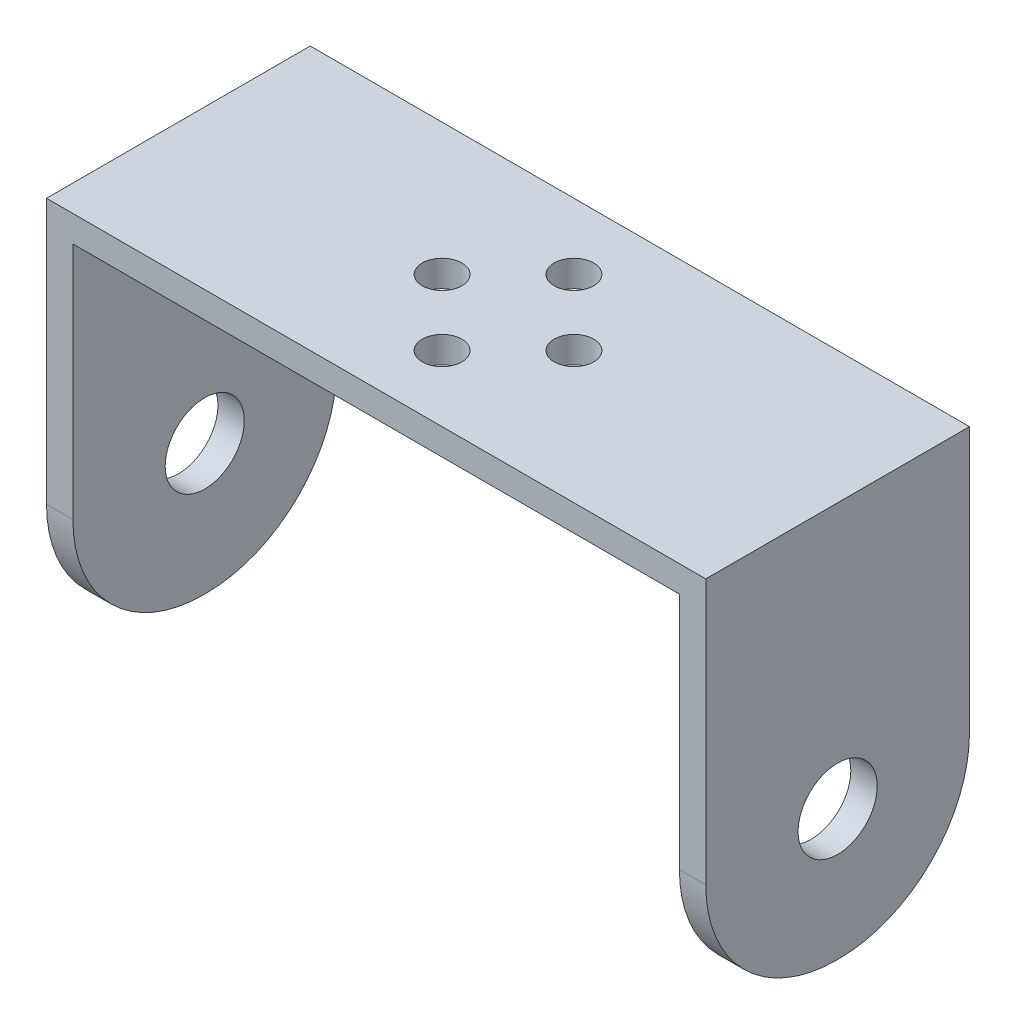
ISO-10303-21;
HEADER;
FILE_DESCRIPTION(('STEP AP214'),'2;1');
FILE_NAME('part.step','',(''),(''),'','','');
FILE_SCHEMA(('AUTOMOTIVE_DESIGN { 1 0 10303 214 1 1 1 1 }'));
ENDSEC;
DATA;
#1=APPLICATION_CONTEXT('core data for automotive mechanical design processes');
#2=APPLICATION_PROTOCOL_DEFINITION('international standard','automotive_design',2000,#1);
#3=PRODUCT_CONTEXT('',#1,'mechanical');
#4=PRODUCT('Part','Part','',(#3));
#5=PRODUCT_RELATED_PRODUCT_CATEGORY('part','',(#4));
#6=PRODUCT_DEFINITION_FORMATION('','',#4);
#7=PRODUCT_DEFINITION_CONTEXT('part definition',#1,'design');
#8=PRODUCT_DEFINITION('design','',#6,#7);
#9=PRODUCT_DEFINITION_SHAPE('','',#8);
#10=(LENGTH_UNIT() NAMED_UNIT(*) SI_UNIT(.MILLI.,.METRE.));
#11=(NAMED_UNIT(*) PLANE_ANGLE_UNIT() SI_UNIT($,.RADIAN.));
#12=(NAMED_UNIT(*) SI_UNIT($,.STERADIAN.) SOLID_ANGLE_UNIT());
#13=UNCERTAINTY_MEASURE_WITH_UNIT(LENGTH_MEASURE(1.E-05),#10,'distance_accuracy_value','');
#14=(GEOMETRIC_REPRESENTATION_CONTEXT(3) GLOBAL_UNCERTAINTY_ASSIGNED_CONTEXT((#13)) GLOBAL_UNIT_ASSIGNED_CONTEXT((#10,
#11,#12)) REPRESENTATION_CONTEXT('',''));
#15=CARTESIAN_POINT('',(0.,0.,0.));
#16=DIRECTION('',(0.,0.,1.));
#17=DIRECTION('',(1.,0.,0.));
#18=AXIS2_PLACEMENT_3D('',#15,#16,#17);
#19=CARTESIAN_POINT('',(0.,0.,0.));
#20=DIRECTION('',(0.,1.,0.));
#21=DIRECTION('',(0.,0.,1.));
#22=AXIS2_PLACEMENT_3D('',#19,#20,#21);
#23=PLANE('',#22);
#24=CARTESIAN_POINT('',(0.,0.,-5.));
#25=DIRECTION('',(0.,1.,0.));
#26=DIRECTION('',(0.,0.,1.));
#27=AXIS2_PLACEMENT_3D('',#24,#25,#26);
#28=CIRCLE('',#27,1.5);
#29=CARTESIAN_POINT('',(0.,0.,-3.5));
#30=VERTEX_POINT('',#29);
#31=EDGE_CURVE('E458',#30,#30,#28,.T.);
#32=ORIENTED_EDGE('',*,*,#31,.T.);
#33=EDGE_LOOP('',(#32));
#34=FACE_BOUND('',#33,.T.);
#35=CARTESIAN_POINT('',(5.,0.,0.));
#36=DIRECTION('',(0.,1.,0.));
#37=DIRECTION('',(0.,0.,1.));
#38=AXIS2_PLACEMENT_3D('',#35,#36,#37);
#39=CIRCLE('',#38,1.5);
#40=CARTESIAN_POINT('',(5.,0.,1.5));
#41=VERTEX_POINT('',#40);
#42=EDGE_CURVE('E463',#41,#41,#39,.T.);
#43=ORIENTED_EDGE('',*,*,#42,.T.);
#44=EDGE_LOOP('',(#43));
#45=FACE_BOUND('',#44,.T.);
#46=CARTESIAN_POINT('',(0.,0.,5.));
#47=DIRECTION('',(0.,1.,0.));
#48=DIRECTION('',(0.,0.,1.));
#49=AXIS2_PLACEMENT_3D('',#46,#47,#48);
#50=CIRCLE('',#49,1.5);
#51=CARTESIAN_POINT('',(0.,0.,6.5));
#52=VERTEX_POINT('',#51);
#53=EDGE_CURVE('E476',#52,#52,#50,.T.);
#54=ORIENTED_EDGE('',*,*,#53,.T.);
#55=EDGE_LOOP('',(#54));
#56=FACE_BOUND('',#55,.T.);
#57=CARTESIAN_POINT('',(-5.,0.,0.));
#58=DIRECTION('',(0.,1.,0.));
#59=DIRECTION('',(0.,0.,1.));
#60=AXIS2_PLACEMENT_3D('',#57,#58,#59);
#61=CIRCLE('',#60,1.5);
#62=CARTESIAN_POINT('',(-5.,0.,1.5));
#63=VERTEX_POINT('',#62);
#64=EDGE_CURVE('E484',#63,#63,#61,.T.);
#65=ORIENTED_EDGE('',*,*,#64,.T.);
#66=EDGE_LOOP('',(#65));
#67=FACE_BOUND('',#66,.T.);
#68=DIRECTION('',(0.,0.,-1.));
#69=VECTOR('',#68,1.);
#70=CARTESIAN_POINT('',(23.,0.,0.));
#71=LINE('',#70,#69);
#72=CARTESIAN_POINT('',(23.,0.,9.99999999999999));
#73=VERTEX_POINT('',#72);
#74=CARTESIAN_POINT('',(23.,0.,-10.));
#75=VERTEX_POINT('',#74);
#76=EDGE_CURVE('E184',#73,#75,#71,.T.);
#77=ORIENTED_EDGE('',*,*,#76,.F.);
#78=DIRECTION('',(1.,0.,0.));
#79=VECTOR('',#78,1.);
#80=CARTESIAN_POINT('',(25.,0.,9.99999999999999));
#81=LINE('',#80,#79);
#82=CARTESIAN_POINT('',(-23.,0.,10.));
#83=VERTEX_POINT('',#82);
#84=EDGE_CURVE('E135',#83,#73,#81,.T.);
#85=ORIENTED_EDGE('',*,*,#84,.F.);
#86=DIRECTION('',(0.,0.,1.));
#87=VECTOR('',#86,1.);
#88=CARTESIAN_POINT('',(-23.,0.,0.));
#89=LINE('',#88,#87);
#90=CARTESIAN_POINT('',(-23.,0.,-10.));
#91=VERTEX_POINT('',#90);
#92=EDGE_CURVE('E11',#91,#83,#89,.T.);
#93=ORIENTED_EDGE('',*,*,#92,.F.);
#94=DIRECTION('',(-1.,0.,0.));
#95=VECTOR('',#94,1.);
#96=CARTESIAN_POINT('',(25.,0.,-10.));
#97=LINE('',#96,#95);
#98=EDGE_CURVE('E248',#75,#91,#97,.T.);
#99=ORIENTED_EDGE('',*,*,#98,.F.);
#100=EDGE_LOOP('',(#77,#85,#93,#99));
#101=FACE_BOUND('',#100,.T.);
#102=ADVANCED_FACE('F38',(#34,#45,#56,#67,#101),#23,.F.);
#103=CARTESIAN_POINT('',(-25.,2.,10.));
#104=DIRECTION('',(1.,0.,0.));
#105=DIRECTION('',(0.,0.,-1.));
#106=AXIS2_PLACEMENT_3D('',#103,#104,#105);
#107=PLANE('',#106);
#108=DIRECTION('',(0.,-1.,0.));
#109=VECTOR('',#108,1.);
#110=CARTESIAN_POINT('',(-25.,2.,-10.));
#111=LINE('',#110,#109);
#112=CARTESIAN_POINT('',(-25.,2.,-10.));
#113=VERTEX_POINT('',#112);
#114=CARTESIAN_POINT('',(-25.,-18.1,-10.));
#115=VERTEX_POINT('',#114);
#116=EDGE_CURVE('E255',#113,#115,#111,.T.);
#117=ORIENTED_EDGE('',*,*,#116,.T.);
#118=CARTESIAN_POINT('',(-25.,-18.1,-0.0999999999999952));
#119=DIRECTION('',(-1.,0.,0.));
#120=DIRECTION('',(0.,0.,1.));
#121=AXIS2_PLACEMENT_3D('',#118,#119,#120);
#122=CIRCLE('',#121,9.9);
#123=CARTESIAN_POINT('',(-25.,-28.,-0.0999999999999952));
#124=VERTEX_POINT('',#123);
#125=EDGE_CURVE('E197',#115,#124,#122,.T.);
#126=ORIENTED_EDGE('',*,*,#125,.T.);
#127=DIRECTION('',(0.,0.,1.));
#128=VECTOR('',#127,1.);
#129=CARTESIAN_POINT('',(-25.,-28.,-0.0999999999999952));
#130=LINE('',#129,#128);
#131=CARTESIAN_POINT('',(-25.,-28.,0.100000000000002));
#132=VERTEX_POINT('',#131);
#133=EDGE_CURVE('E224',#124,#132,#130,.T.);
#134=ORIENTED_EDGE('',*,*,#133,.T.);
#135=CARTESIAN_POINT('',(-25.,-18.1,0.100000000000004));
#136=DIRECTION('',(-1.,0.,0.));
#137=DIRECTION('',(0.,0.,1.));
#138=AXIS2_PLACEMENT_3D('',#135,#136,#137);
#139=CIRCLE('',#138,9.9);
#140=CARTESIAN_POINT('',(-25.,-18.1,10.));
#141=VERTEX_POINT('',#140);
#142=EDGE_CURVE('E205',#132,#141,#139,.T.);
#143=ORIENTED_EDGE('',*,*,#142,.T.);
#144=DIRECTION('',(0.,-1.,0.));
#145=VECTOR('',#144,1.);
#146=CARTESIAN_POINT('',(-25.,2.,10.));
#147=LINE('',#146,#145);
#148=CARTESIAN_POINT('',(-25.,2.,10.));
#149=VERTEX_POINT('',#148);
#150=EDGE_CURVE('E47',#149,#141,#147,.T.);
#151=ORIENTED_EDGE('',*,*,#150,.F.);
#152=DIRECTION('',(0.,0.,1.));
#153=VECTOR('',#152,1.);
#154=CARTESIAN_POINT('',(-25.,2.,10.));
#155=LINE('',#154,#153);
#156=EDGE_CURVE('E244',#113,#149,#155,.T.);
#157=ORIENTED_EDGE('',*,*,#156,.F.);
#158=EDGE_LOOP('',(#117,#126,#134,#143,#151,#157));
#159=FACE_BOUND('',#158,.T.);
#160=CARTESIAN_POINT('',(-25.,-18.1,0.));
#161=DIRECTION('',(-1.,0.,0.));
#162=DIRECTION('',(0.,0.,1.));
#163=AXIS2_PLACEMENT_3D('',#160,#161,#162);
#164=CIRCLE('',#163,3.);
#165=CARTESIAN_POINT('',(-25.,-18.1,3.));
#166=VERTEX_POINT('',#165);
#167=EDGE_CURVE('E192',#166,#166,#164,.T.);
#168=ORIENTED_EDGE('',*,*,#167,.F.);
#169=EDGE_LOOP('',(#168));
#170=FACE_BOUND('',#169,.T.);
#171=ADVANCED_FACE('F40',(#159,#170),#107,.F.);
#172=CARTESIAN_POINT('',(25.,2.,9.99999999999999));
#173=DIRECTION('',(0.,0.,-1.));
#174=DIRECTION('',(-1.,0.,0.));
#175=AXIS2_PLACEMENT_3D('',#172,#173,#174);
#176=PLANE('',#175);
#177=DIRECTION('',(0.,-1.,0.));
#178=VECTOR('',#177,1.);
#179=CARTESIAN_POINT('',(25.,2.,9.99999999999999));
#180=LINE('',#179,#178);
#181=CARTESIAN_POINT('',(25.,2.,9.99999999999999));
#182=VERTEX_POINT('',#181);
#183=CARTESIAN_POINT('',(25.,-18.1,10.));
#184=VERTEX_POINT('',#183);
#185=EDGE_CURVE('E265',#182,#184,#180,.T.);
#186=ORIENTED_EDGE('',*,*,#185,.F.);
#187=DIRECTION('',(1.,0.,0.));
#188=VECTOR('',#187,1.);
#189=CARTESIAN_POINT('',(25.,2.,9.99999999999999));
#190=LINE('',#189,#188);
#191=EDGE_CURVE('E247',#149,#182,#190,.T.);
#192=ORIENTED_EDGE('',*,*,#191,.F.);
#193=ORIENTED_EDGE('',*,*,#150,.T.);
#194=DIRECTION('',(-1.,0.,0.));
#195=VECTOR('',#194,1.);
#196=CARTESIAN_POINT('',(-23.,-18.1,10.));
#197=LINE('',#196,#195);
#198=CARTESIAN_POINT('',(-23.,-18.1,10.));
#199=VERTEX_POINT('',#198);
#200=EDGE_CURVE('E231',#199,#141,#197,.T.);
#201=ORIENTED_EDGE('',*,*,#200,.F.);
#202=DIRECTION('',(0.,1.,0.));
#203=VECTOR('',#202,1.);
#204=CARTESIAN_POINT('',(-23.,2.,10.));
#205=LINE('',#204,#203);
#206=EDGE_CURVE('E217',#199,#83,#205,.T.);
#207=ORIENTED_EDGE('',*,*,#206,.T.);
#208=ORIENTED_EDGE('',*,*,#84,.T.);
#209=DIRECTION('',(0.,-1.,0.));
#210=VECTOR('',#209,1.);
#211=CARTESIAN_POINT('',(23.,2.,9.99999999999999));
#212=LINE('',#211,#210);
#213=CARTESIAN_POINT('',(23.,-18.1,10.));
#214=VERTEX_POINT('',#213);
#215=EDGE_CURVE('E127',#73,#214,#212,.T.);
#216=ORIENTED_EDGE('',*,*,#215,.T.);
#217=DIRECTION('',(1.,0.,0.));
#218=VECTOR('',#217,1.);
#219=CARTESIAN_POINT('',(23.,-18.1,10.));
#220=LINE('',#219,#218);
#221=EDGE_CURVE('E131',#214,#184,#220,.T.);
#222=ORIENTED_EDGE('',*,*,#221,.T.);
#223=EDGE_LOOP('',(#186,#192,#193,#201,#207,#208,#216,#222));
#224=FACE_BOUND('',#223,.T.);
#225=ADVANCED_FACE('F130',(#224),#176,.F.);
#226=CARTESIAN_POINT('',(25.,2.,9.99999999999999));
#227=DIRECTION('',(-1.,0.,0.));
#228=DIRECTION('',(0.,0.,1.));
#229=AXIS2_PLACEMENT_3D('',#226,#227,#228);
#230=PLANE('',#229);
#231=ORIENTED_EDGE('',*,*,#185,.T.);
#232=CARTESIAN_POINT('',(25.,-18.1,0.0999999999999994));
#233=DIRECTION('',(1.,0.,0.));
#234=DIRECTION('',(0.,0.,-1.));
#235=AXIS2_PLACEMENT_3D('',#232,#233,#234);
#236=CIRCLE('',#235,9.9);
#237=CARTESIAN_POINT('',(25.,-28.,0.0999999999999994));
#238=VERTEX_POINT('',#237);
#239=EDGE_CURVE('E147',#184,#238,#236,.T.);
#240=ORIENTED_EDGE('',*,*,#239,.T.);
#241=DIRECTION('',(0.,0.,-1.));
#242=VECTOR('',#241,1.);
#243=CARTESIAN_POINT('',(25.,-28.,0.0999999999999994));
#244=LINE('',#243,#242);
#245=CARTESIAN_POINT('',(25.,-28.,-0.100000000000004));
#246=VERTEX_POINT('',#245);
#247=EDGE_CURVE('E172',#238,#246,#244,.T.);
#248=ORIENTED_EDGE('',*,*,#247,.T.);
#249=CARTESIAN_POINT('',(25.,-18.1,-0.100000000000005));
#250=DIRECTION('',(1.,0.,0.));
#251=DIRECTION('',(0.,0.,-1.));
#252=AXIS2_PLACEMENT_3D('',#249,#250,#251);
#253=CIRCLE('',#252,9.9);
#254=CARTESIAN_POINT('',(25.,-18.1,-10.));
#255=VERTEX_POINT('',#254);
#256=EDGE_CURVE('E141',#246,#255,#253,.T.);
#257=ORIENTED_EDGE('',*,*,#256,.T.);
#258=DIRECTION('',(0.,-1.,0.));
#259=VECTOR('',#258,1.);
#260=CARTESIAN_POINT('',(25.,2.,-10.));
#261=LINE('',#260,#259);
#262=CARTESIAN_POINT('',(25.,2.,-10.));
#263=VERTEX_POINT('',#262);
#264=EDGE_CURVE('E262',#263,#255,#261,.T.);
#265=ORIENTED_EDGE('',*,*,#264,.F.);
#266=DIRECTION('',(0.,0.,-1.));
#267=VECTOR('',#266,1.);
#268=CARTESIAN_POINT('',(25.,2.,9.99999999999999));
#269=LINE('',#268,#267);
#270=EDGE_CURVE('E59',#182,#263,#269,.T.);
#271=ORIENTED_EDGE('',*,*,#270,.F.);
#272=EDGE_LOOP('',(#231,#240,#248,#257,#265,#271));
#273=FACE_BOUND('',#272,.T.);
#274=CARTESIAN_POINT('',(25.,-18.1,0.));
#275=DIRECTION('',(1.,0.,0.));
#276=DIRECTION('',(0.,0.,-1.));
#277=AXIS2_PLACEMENT_3D('',#274,#275,#276);
#278=CIRCLE('',#277,3.);
#279=CARTESIAN_POINT('',(25.,-18.1,-3.));
#280=VERTEX_POINT('',#279);
#281=EDGE_CURVE('E467',#280,#280,#278,.T.);
#282=ORIENTED_EDGE('',*,*,#281,.F.);
#283=EDGE_LOOP('',(#282));
#284=FACE_BOUND('',#283,.T.);
#285=ADVANCED_FACE('F296',(#273,#284),#230,.F.);
#286=CARTESIAN_POINT('',(25.,2.,-10.));
#287=DIRECTION('',(0.,0.,1.));
#288=DIRECTION('',(1.,0.,0.));
#289=AXIS2_PLACEMENT_3D('',#286,#287,#288);
#290=PLANE('',#289);
#291=ORIENTED_EDGE('',*,*,#264,.T.);
#292=DIRECTION('',(1.,0.,0.));
#293=VECTOR('',#292,1.);
#294=CARTESIAN_POINT('',(23.,-18.1,-10.));
#295=LINE('',#294,#293);
#296=CARTESIAN_POINT('',(23.,-18.1,-10.));
#297=VERTEX_POINT('',#296);
#298=EDGE_CURVE('E180',#297,#255,#295,.T.);
#299=ORIENTED_EDGE('',*,*,#298,.F.);
#300=DIRECTION('',(0.,1.,0.));
#301=VECTOR('',#300,1.);
#302=CARTESIAN_POINT('',(23.,2.,-10.));
#303=LINE('',#302,#301);
#304=EDGE_CURVE('E150',#297,#75,#303,.T.);
#305=ORIENTED_EDGE('',*,*,#304,.T.);
#306=ORIENTED_EDGE('',*,*,#98,.T.);
#307=DIRECTION('',(0.,-1.,0.));
#308=VECTOR('',#307,1.);
#309=CARTESIAN_POINT('',(-23.,2.,-10.));
#310=LINE('',#309,#308);
#311=CARTESIAN_POINT('',(-23.,-18.1,-10.));
#312=VERTEX_POINT('',#311);
#313=EDGE_CURVE('E201',#91,#312,#310,.T.);
#314=ORIENTED_EDGE('',*,*,#313,.T.);
#315=DIRECTION('',(-1.,0.,0.));
#316=VECTOR('',#315,1.);
#317=CARTESIAN_POINT('',(-23.,-18.1,-10.));
#318=LINE('',#317,#316);
#319=EDGE_CURVE('E220',#312,#115,#318,.T.);
#320=ORIENTED_EDGE('',*,*,#319,.T.);
#321=ORIENTED_EDGE('',*,*,#116,.F.);
#322=DIRECTION('',(-1.,0.,0.));
#323=VECTOR('',#322,1.);
#324=CARTESIAN_POINT('',(25.,2.,-10.));
#325=LINE('',#324,#323);
#326=EDGE_CURVE('E54',#263,#113,#325,.T.);
#327=ORIENTED_EDGE('',*,*,#326,.F.);
#328=EDGE_LOOP('',(#291,#299,#305,#306,#314,#320,#321,#327));
#329=FACE_BOUND('',#328,.T.);
#330=ADVANCED_FACE('F291',(#329),#290,.F.);
#331=CARTESIAN_POINT('',(0.,2.,0.));
#332=DIRECTION('',(0.,1.,0.));
#333=DIRECTION('',(0.,0.,1.));
#334=AXIS2_PLACEMENT_3D('',#331,#332,#333);
#335=PLANE('',#334);
#336=CARTESIAN_POINT('',(0.,2.,-5.));
#337=DIRECTION('',(0.,1.,0.));
#338=DIRECTION('',(0.,0.,1.));
#339=AXIS2_PLACEMENT_3D('',#336,#337,#338);
#340=CIRCLE('',#339,1.5);
#341=CARTESIAN_POINT('',(0.,2.,-3.5));
#342=VERTEX_POINT('',#341);
#343=EDGE_CURVE('E461',#342,#342,#340,.T.);
#344=ORIENTED_EDGE('',*,*,#343,.F.);
#345=EDGE_LOOP('',(#344));
#346=FACE_BOUND('',#345,.T.);
#347=CARTESIAN_POINT('',(5.,2.,0.));
#348=DIRECTION('',(0.,1.,0.));
#349=DIRECTION('',(0.,0.,1.));
#350=AXIS2_PLACEMENT_3D('',#347,#348,#349);
#351=CIRCLE('',#350,1.5);
#352=CARTESIAN_POINT('',(5.,2.,1.5));
#353=VERTEX_POINT('',#352);
#354=EDGE_CURVE('E470',#353,#353,#351,.T.);
#355=ORIENTED_EDGE('',*,*,#354,.F.);
#356=EDGE_LOOP('',(#355));
#357=FACE_BOUND('',#356,.T.);
#358=CARTESIAN_POINT('',(0.,2.,5.));
#359=DIRECTION('',(0.,1.,0.));
#360=DIRECTION('',(0.,0.,1.));
#361=AXIS2_PLACEMENT_3D('',#358,#359,#360);
#362=CIRCLE('',#361,1.5);
#363=CARTESIAN_POINT('',(0.,2.,6.5));
#364=VERTEX_POINT('',#363);
#365=EDGE_CURVE('E480',#364,#364,#362,.T.);
#366=ORIENTED_EDGE('',*,*,#365,.F.);
#367=EDGE_LOOP('',(#366));
#368=FACE_BOUND('',#367,.T.);
#369=CARTESIAN_POINT('',(-5.,2.,0.));
#370=DIRECTION('',(0.,1.,0.));
#371=DIRECTION('',(0.,0.,1.));
#372=AXIS2_PLACEMENT_3D('',#369,#370,#371);
#373=CIRCLE('',#372,1.5);
#374=CARTESIAN_POINT('',(-5.,2.,1.5));
#375=VERTEX_POINT('',#374);
#376=EDGE_CURVE('E488',#375,#375,#373,.T.);
#377=ORIENTED_EDGE('',*,*,#376,.F.);
#378=EDGE_LOOP('',(#377));
#379=FACE_BOUND('',#378,.T.);
#380=ORIENTED_EDGE('',*,*,#326,.T.);
#381=ORIENTED_EDGE('',*,*,#156,.T.);
#382=ORIENTED_EDGE('',*,*,#191,.T.);
#383=ORIENTED_EDGE('',*,*,#270,.T.);
#384=EDGE_LOOP('',(#380,#381,#382,#383));
#385=FACE_BOUND('',#384,.T.);
#386=ADVANCED_FACE('F322',(#346,#357,#368,#379,#385),#335,.T.);
#387=CARTESIAN_POINT('',(-23.,-18.1,-0.0999999999999952));
#388=DIRECTION('',(-1.,0.,0.));
#389=DIRECTION('',(0.,0.,1.));
#390=AXIS2_PLACEMENT_3D('',#387,#388,#389);
#391=PLANE('',#390);
#392=CARTESIAN_POINT('',(-23.,-18.1,0.));
#393=DIRECTION('',(-1.,0.,0.));
#394=DIRECTION('',(0.,0.,1.));
#395=AXIS2_PLACEMENT_3D('',#392,#393,#394);
#396=CIRCLE('',#395,3.);
#397=CARTESIAN_POINT('',(-23.,-18.1,3.));
#398=VERTEX_POINT('',#397);
#399=EDGE_CURVE('E193',#398,#398,#396,.T.);
#400=ORIENTED_EDGE('',*,*,#399,.T.);
#401=EDGE_LOOP('',(#400));
#402=FACE_BOUND('',#401,.T.);
#403=ORIENTED_EDGE('',*,*,#313,.F.);
#404=ORIENTED_EDGE('',*,*,#92,.T.);
#405=ORIENTED_EDGE('',*,*,#206,.F.);
#406=CARTESIAN_POINT('',(-23.,-18.1,0.100000000000004));
#407=DIRECTION('',(-1.,0.,0.));
#408=DIRECTION('',(0.,0.,1.));
#409=AXIS2_PLACEMENT_3D('',#406,#407,#408);
#410=CIRCLE('',#409,9.9);
#411=CARTESIAN_POINT('',(-23.,-28.,0.100000000000002));
#412=VERTEX_POINT('',#411);
#413=EDGE_CURVE('E213',#412,#199,#410,.T.);
#414=ORIENTED_EDGE('',*,*,#413,.F.);
#415=DIRECTION('',(0.,0.,1.));
#416=VECTOR('',#415,1.);
#417=CARTESIAN_POINT('',(-23.,-28.,-0.0999999999999952));
#418=LINE('',#417,#416);
#419=CARTESIAN_POINT('',(-23.,-28.,-0.0999999999999952));
#420=VERTEX_POINT('',#419);
#421=EDGE_CURVE('E209',#420,#412,#418,.T.);
#422=ORIENTED_EDGE('',*,*,#421,.F.);
#423=CARTESIAN_POINT('',(-23.,-18.1,-0.0999999999999952));
#424=DIRECTION('',(-1.,0.,0.));
#425=DIRECTION('',(0.,0.,1.));
#426=AXIS2_PLACEMENT_3D('',#423,#424,#425);
#427=CIRCLE('',#426,9.9);
#428=EDGE_CURVE('E204',#312,#420,#427,.T.);
#429=ORIENTED_EDGE('',*,*,#428,.F.);
#430=EDGE_LOOP('',(#403,#404,#405,#414,#422,#429));
#431=FACE_BOUND('',#430,.T.);
#432=ADVANCED_FACE('F284',(#402,#431),#391,.F.);
#433=CARTESIAN_POINT('',(-23.,-18.1,0.100000000000004));
#434=DIRECTION('',(-1.,0.,0.));
#435=DIRECTION('',(0.,0.,1.));
#436=AXIS2_PLACEMENT_3D('',#433,#434,#435);
#437=CYLINDRICAL_SURFACE('',#436,9.9);
#438=ORIENTED_EDGE('',*,*,#142,.F.);
#439=DIRECTION('',(-1.,0.,0.));
#440=VECTOR('',#439,1.);
#441=CARTESIAN_POINT('',(-23.,-28.,0.100000000000002));
#442=LINE('',#441,#440);
#443=EDGE_CURVE('E235',#412,#132,#442,.T.);
#444=ORIENTED_EDGE('',*,*,#443,.F.);
#445=ORIENTED_EDGE('',*,*,#413,.T.);
#446=ORIENTED_EDGE('',*,*,#200,.T.);
#447=EDGE_LOOP('',(#438,#444,#445,#446));
#448=FACE_BOUND('',#447,.T.);
#449=ADVANCED_FACE('F274',(#448),#437,.T.);
#450=CARTESIAN_POINT('',(-23.,-28.,-0.0999999999999952));
#451=DIRECTION('',(0.,-1.,0.));
#452=DIRECTION('',(0.,0.,-1.));
#453=AXIS2_PLACEMENT_3D('',#450,#451,#452);
#454=PLANE('',#453);
#455=ORIENTED_EDGE('',*,*,#133,.F.);
#456=DIRECTION('',(-1.,0.,0.));
#457=VECTOR('',#456,1.);
#458=CARTESIAN_POINT('',(-23.,-28.,-0.0999999999999952));
#459=LINE('',#458,#457);
#460=EDGE_CURVE('E238',#420,#124,#459,.T.);
#461=ORIENTED_EDGE('',*,*,#460,.F.);
#462=ORIENTED_EDGE('',*,*,#421,.T.);
#463=ORIENTED_EDGE('',*,*,#443,.T.);
#464=EDGE_LOOP('',(#455,#461,#462,#463));
#465=FACE_BOUND('',#464,.T.);
#466=ADVANCED_FACE('F280',(#465),#454,.T.);
#467=CARTESIAN_POINT('',(-23.,-18.1,-0.0999999999999952));
#468=DIRECTION('',(-1.,0.,0.));
#469=DIRECTION('',(0.,0.,1.));
#470=AXIS2_PLACEMENT_3D('',#467,#468,#469);
#471=CYLINDRICAL_SURFACE('',#470,9.9);
#472=ORIENTED_EDGE('',*,*,#125,.F.);
#473=ORIENTED_EDGE('',*,*,#319,.F.);
#474=ORIENTED_EDGE('',*,*,#428,.T.);
#475=ORIENTED_EDGE('',*,*,#460,.T.);
#476=EDGE_LOOP('',(#472,#473,#474,#475));
#477=FACE_BOUND('',#476,.T.);
#478=ADVANCED_FACE('F371',(#477),#471,.T.);
#479=CARTESIAN_POINT('',(-23.,-18.1,0.));
#480=DIRECTION('',(-1.,0.,0.));
#481=DIRECTION('',(0.,0.,1.));
#482=AXIS2_PLACEMENT_3D('',#479,#480,#481);
#483=CYLINDRICAL_SURFACE('',#482,3.);
#484=ORIENTED_EDGE('',*,*,#399,.F.);
#485=EDGE_LOOP('',(#484));
#486=FACE_BOUND('',#485,.T.);
#487=ORIENTED_EDGE('',*,*,#167,.T.);
#488=EDGE_LOOP('',(#487));
#489=FACE_BOUND('',#488,.T.);
#490=ADVANCED_FACE('F378',(#486,#489),#483,.F.);
#491=CARTESIAN_POINT('',(23.,-18.1,0.0999999999999994));
#492=DIRECTION('',(1.,0.,0.));
#493=DIRECTION('',(0.,0.,-1.));
#494=AXIS2_PLACEMENT_3D('',#491,#492,#493);
#495=PLANE('',#494);
#496=CARTESIAN_POINT('',(23.,-18.1,0.));
#497=DIRECTION('',(1.,0.,0.));
#498=DIRECTION('',(0.,0.,-1.));
#499=AXIS2_PLACEMENT_3D('',#496,#497,#498);
#500=CIRCLE('',#499,3.);
#501=CARTESIAN_POINT('',(23.,-18.1,-3.));
#502=VERTEX_POINT('',#501);
#503=EDGE_CURVE('E173',#502,#502,#500,.T.);
#504=ORIENTED_EDGE('',*,*,#503,.T.);
#505=EDGE_LOOP('',(#504));
#506=FACE_BOUND('',#505,.T.);
#507=ORIENTED_EDGE('',*,*,#215,.F.);
#508=ORIENTED_EDGE('',*,*,#76,.T.);
#509=ORIENTED_EDGE('',*,*,#304,.F.);
#510=CARTESIAN_POINT('',(23.,-18.1,-0.100000000000005));
#511=DIRECTION('',(1.,0.,0.));
#512=DIRECTION('',(0.,0.,-1.));
#513=AXIS2_PLACEMENT_3D('',#510,#511,#512);
#514=CIRCLE('',#513,9.9);
#515=CARTESIAN_POINT('',(23.,-28.,-0.100000000000004));
#516=VERTEX_POINT('',#515);
#517=EDGE_CURVE('E160',#516,#297,#514,.T.);
#518=ORIENTED_EDGE('',*,*,#517,.F.);
#519=DIRECTION('',(0.,0.,-1.));
#520=VECTOR('',#519,1.);
#521=CARTESIAN_POINT('',(23.,-28.,0.0999999999999994));
#522=LINE('',#521,#520);
#523=CARTESIAN_POINT('',(23.,-28.,0.0999999999999994));
#524=VERTEX_POINT('',#523);
#525=EDGE_CURVE('E156',#524,#516,#522,.T.);
#526=ORIENTED_EDGE('',*,*,#525,.F.);
#527=CARTESIAN_POINT('',(23.,-18.1,0.0999999999999994));
#528=DIRECTION('',(1.,0.,0.));
#529=DIRECTION('',(0.,0.,-1.));
#530=AXIS2_PLACEMENT_3D('',#527,#528,#529);
#531=CIRCLE('',#530,9.9);
#532=EDGE_CURVE('E140',#214,#524,#531,.T.);
#533=ORIENTED_EDGE('',*,*,#532,.F.);
#534=EDGE_LOOP('',(#507,#508,#509,#518,#526,#533));
#535=FACE_BOUND('',#534,.T.);
#536=ADVANCED_FACE('F153',(#506,#535),#495,.F.);
#537=CARTESIAN_POINT('',(23.,-18.1,-0.100000000000005));
#538=DIRECTION('',(1.,0.,0.));
#539=DIRECTION('',(0.,0.,-1.));
#540=AXIS2_PLACEMENT_3D('',#537,#538,#539);
#541=CYLINDRICAL_SURFACE('',#540,9.9);
#542=ORIENTED_EDGE('',*,*,#256,.F.);
#543=DIRECTION('',(1.,0.,0.));
#544=VECTOR('',#543,1.);
#545=CARTESIAN_POINT('',(23.,-28.,-0.100000000000004));
#546=LINE('',#545,#544);
#547=EDGE_CURVE('E185',#516,#246,#546,.T.);
#548=ORIENTED_EDGE('',*,*,#547,.F.);
#549=ORIENTED_EDGE('',*,*,#517,.T.);
#550=ORIENTED_EDGE('',*,*,#298,.T.);
#551=EDGE_LOOP('',(#542,#548,#549,#550));
#552=FACE_BOUND('',#551,.T.);
#553=ADVANCED_FACE('F294',(#552),#541,.T.);
#554=CARTESIAN_POINT('',(23.,-28.,0.0999999999999994));
#555=DIRECTION('',(0.,-1.,0.));
#556=DIRECTION('',(0.,0.,-1.));
#557=AXIS2_PLACEMENT_3D('',#554,#555,#556);
#558=PLANE('',#557);
#559=ORIENTED_EDGE('',*,*,#247,.F.);
#560=DIRECTION('',(1.,0.,0.));
#561=VECTOR('',#560,1.);
#562=CARTESIAN_POINT('',(23.,-28.,0.0999999999999994));
#563=LINE('',#562,#561);
#564=EDGE_CURVE('E149',#524,#238,#563,.T.);
#565=ORIENTED_EDGE('',*,*,#564,.F.);
#566=ORIENTED_EDGE('',*,*,#525,.T.);
#567=ORIENTED_EDGE('',*,*,#547,.T.);
#568=EDGE_LOOP('',(#559,#565,#566,#567));
#569=FACE_BOUND('',#568,.T.);
#570=ADVANCED_FACE('F300',(#569),#558,.T.);
#571=CARTESIAN_POINT('',(23.,-18.1,0.0999999999999994));
#572=DIRECTION('',(1.,0.,0.));
#573=DIRECTION('',(0.,0.,-1.));
#574=AXIS2_PLACEMENT_3D('',#571,#572,#573);
#575=CYLINDRICAL_SURFACE('',#574,9.9);
#576=ORIENTED_EDGE('',*,*,#239,.F.);
#577=ORIENTED_EDGE('',*,*,#221,.F.);
#578=ORIENTED_EDGE('',*,*,#532,.T.);
#579=ORIENTED_EDGE('',*,*,#564,.T.);
#580=EDGE_LOOP('',(#576,#577,#578,#579));
#581=FACE_BOUND('',#580,.T.);
#582=ADVANCED_FACE('F145',(#581),#575,.T.);
#583=CARTESIAN_POINT('',(23.,-18.1,0.));
#584=DIRECTION('',(1.,0.,0.));
#585=DIRECTION('',(0.,0.,-1.));
#586=AXIS2_PLACEMENT_3D('',#583,#584,#585);
#587=CYLINDRICAL_SURFACE('',#586,3.);
#588=ORIENTED_EDGE('',*,*,#503,.F.);
#589=EDGE_LOOP('',(#588));
#590=FACE_BOUND('',#589,.T.);
#591=ORIENTED_EDGE('',*,*,#281,.T.);
#592=EDGE_LOOP('',(#591));
#593=FACE_BOUND('',#592,.T.);
#594=ADVANCED_FACE('F307',(#590,#593),#587,.F.);
#595=CARTESIAN_POINT('',(-5.,0.,0.));
#596=DIRECTION('',(0.,1.,0.));
#597=DIRECTION('',(0.,0.,1.));
#598=AXIS2_PLACEMENT_3D('',#595,#596,#597);
#599=CYLINDRICAL_SURFACE('',#598,1.5);
#600=ORIENTED_EDGE('',*,*,#64,.F.);
#601=EDGE_LOOP('',(#600));
#602=FACE_BOUND('',#601,.T.);
#603=ORIENTED_EDGE('',*,*,#376,.T.);
#604=EDGE_LOOP('',(#603));
#605=FACE_BOUND('',#604,.T.);
#606=ADVANCED_FACE('F412',(#602,#605),#599,.F.);
#607=CARTESIAN_POINT('',(0.,0.,5.));
#608=DIRECTION('',(0.,1.,0.));
#609=DIRECTION('',(0.,0.,1.));
#610=AXIS2_PLACEMENT_3D('',#607,#608,#609);
#611=CYLINDRICAL_SURFACE('',#610,1.5);
#612=ORIENTED_EDGE('',*,*,#53,.F.);
#613=EDGE_LOOP('',(#612));
#614=FACE_BOUND('',#613,.T.);
#615=ORIENTED_EDGE('',*,*,#365,.T.);
#616=EDGE_LOOP('',(#615));
#617=FACE_BOUND('',#616,.T.);
#618=ADVANCED_FACE('F422',(#614,#617),#611,.F.);
#619=CARTESIAN_POINT('',(5.,0.,0.));
#620=DIRECTION('',(0.,1.,0.));
#621=DIRECTION('',(0.,0.,1.));
#622=AXIS2_PLACEMENT_3D('',#619,#620,#621);
#623=CYLINDRICAL_SURFACE('',#622,1.5);
#624=ORIENTED_EDGE('',*,*,#42,.F.);
#625=EDGE_LOOP('',(#624));
#626=FACE_BOUND('',#625,.T.);
#627=ORIENTED_EDGE('',*,*,#354,.T.);
#628=EDGE_LOOP('',(#627));
#629=FACE_BOUND('',#628,.T.);
#630=ADVANCED_FACE('F429',(#626,#629),#623,.F.);
#631=CARTESIAN_POINT('',(0.,0.,-5.));
#632=DIRECTION('',(0.,1.,0.));
#633=DIRECTION('',(0.,0.,1.));
#634=AXIS2_PLACEMENT_3D('',#631,#632,#633);
#635=CYLINDRICAL_SURFACE('',#634,1.5);
#636=ORIENTED_EDGE('',*,*,#31,.F.);
#637=EDGE_LOOP('',(#636));
#638=FACE_BOUND('',#637,.T.);
#639=ORIENTED_EDGE('',*,*,#343,.T.);
#640=EDGE_LOOP('',(#639));
#641=FACE_BOUND('',#640,.T.);
#642=ADVANCED_FACE('F437',(#638,#641),#635,.F.);
#643=CLOSED_SHELL('',(#102,#171,#225,#285,#330,#386,#432,#449,#466,#478,#490,#536,#553,#570,
#582,#594,#606,#618,#630,#642));
#644=MANIFOLD_SOLID_BREP('B2',#643);
#645=ADVANCED_BREP_SHAPE_REPRESENTATION('',(#18,#644),#14);
#646=SHAPE_DEFINITION_REPRESENTATION(#9,#645);
ENDSEC;
END-ISO-10303-21;
